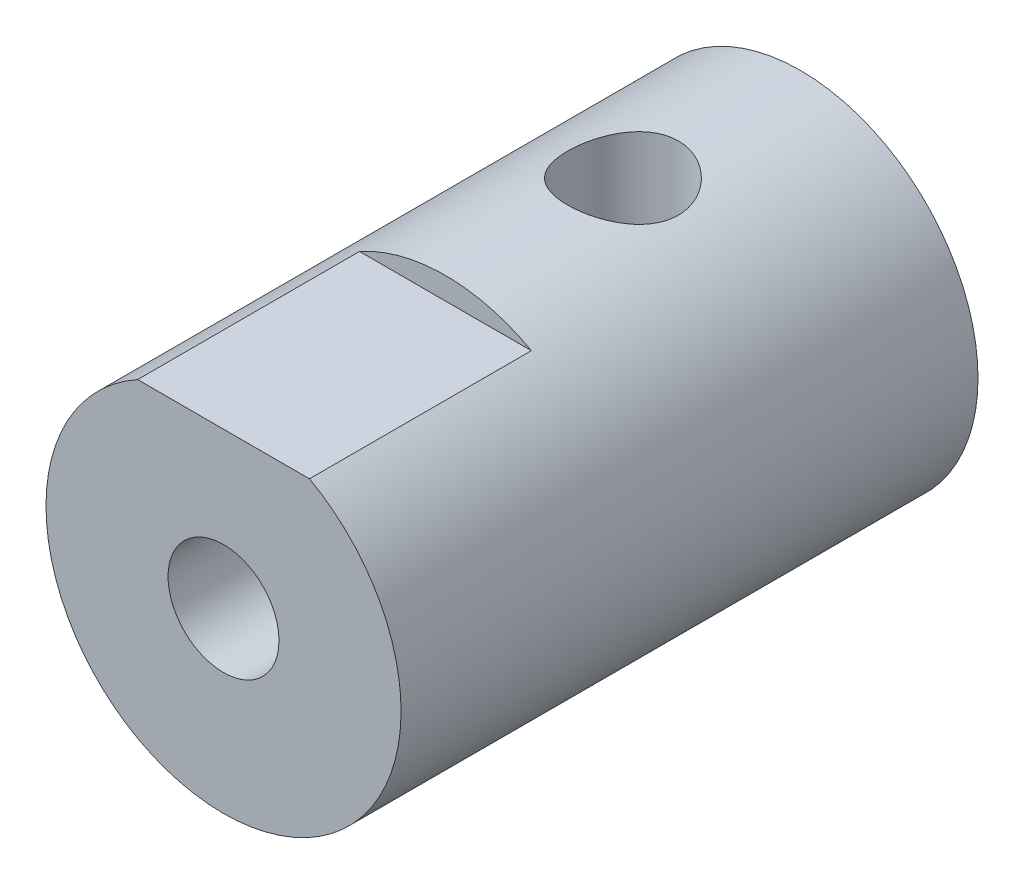
ISO-10303-21;
HEADER;
FILE_DESCRIPTION(('STEP AP214'),'2;1');
FILE_NAME('part.step','',(''),(''),'','','');
FILE_SCHEMA(('AUTOMOTIVE_DESIGN { 1 0 10303 214 1 1 1 1 }'));
ENDSEC;
DATA;
#1=APPLICATION_CONTEXT('core data for automotive mechanical design processes');
#2=APPLICATION_PROTOCOL_DEFINITION('international standard','automotive_design',2000,#1);
#3=PRODUCT_CONTEXT('',#1,'mechanical');
#4=PRODUCT('Part','Part','',(#3));
#5=PRODUCT_RELATED_PRODUCT_CATEGORY('part','',(#4));
#6=PRODUCT_DEFINITION_FORMATION('','',#4);
#7=PRODUCT_DEFINITION_CONTEXT('part definition',#1,'design');
#8=PRODUCT_DEFINITION('design','',#6,#7);
#9=PRODUCT_DEFINITION_SHAPE('','',#8);
#10=(LENGTH_UNIT() NAMED_UNIT(*) SI_UNIT(.MILLI.,.METRE.));
#11=(NAMED_UNIT(*) PLANE_ANGLE_UNIT() SI_UNIT($,.RADIAN.));
#12=(NAMED_UNIT(*) SI_UNIT($,.STERADIAN.) SOLID_ANGLE_UNIT());
#13=UNCERTAINTY_MEASURE_WITH_UNIT(LENGTH_MEASURE(1.E-05),#10,'distance_accuracy_value','');
#14=(GEOMETRIC_REPRESENTATION_CONTEXT(3) GLOBAL_UNCERTAINTY_ASSIGNED_CONTEXT((#13)) GLOBAL_UNIT_ASSIGNED_CONTEXT((#10,
#11,#12)) REPRESENTATION_CONTEXT('',''));
#15=CARTESIAN_POINT('',(0.,0.,0.));
#16=DIRECTION('',(0.,0.,1.));
#17=DIRECTION('',(1.,0.,0.));
#18=AXIS2_PLACEMENT_3D('',#15,#16,#17);
#19=CARTESIAN_POINT('',(0.,0.,5.));
#20=DIRECTION('',(0.,0.,-1.));
#21=DIRECTION('',(-1.,0.,0.));
#22=AXIS2_PLACEMENT_3D('',#19,#20,#21);
#23=CYLINDRICAL_SURFACE('',#22,4.);
#24=CARTESIAN_POINT('',(0.,4.,-2.75));
#25=CARTESIAN_POINT('',(-0.0684391851745465,3.99999965877989,-2.75000044658758));
#26=CARTESIAN_POINT('',(-0.136883052502859,3.99822694984841,-2.75563922694445));
#27=CARTESIAN_POINT('',(-0.271769209588448,3.99132894088807,-2.77798624153924));
#28=CARTESIAN_POINT('',(-0.338211042725907,3.9862028819986,-2.79469698136436));
#29=CARTESIAN_POINT('',(-0.467128543650807,3.97315815697909,-2.83856937119574));
#30=CARTESIAN_POINT('',(-0.529610176985804,3.96524381499025,-2.86571484465297));
#31=CARTESIAN_POINT('',(-0.64913480234646,3.94743969161093,-2.92961731767833));
#32=CARTESIAN_POINT('',(-0.706176935444885,3.93754959899905,-2.96637583178059));
#33=CARTESIAN_POINT('',(-0.814965334952281,3.91650213740282,-3.04965599201736));
#34=CARTESIAN_POINT('',(-0.86652002815666,3.90531715926989,-3.09642088506107));
#35=CARTESIAN_POINT('',(-0.961197382036994,3.88310046374208,-3.19786839241355));
#36=CARTESIAN_POINT('',(-1.0043184728987,3.87206877523457,-3.25255247749455));
#37=CARTESIAN_POINT('',(-1.08194336483114,3.85111144698172,-3.36994456380808));
#38=CARTESIAN_POINT('',(-1.11620784150129,3.84121988301796,-3.43281747752722));
#39=CARTESIAN_POINT('',(-1.17359741076672,3.82407801799234,-3.56379231498187));
#40=CARTESIAN_POINT('',(-1.19672543771945,3.81682702128688,-3.63189285579393));
#41=CARTESIAN_POINT('',(-1.23048459930033,3.80607606984501,-3.76922807745206));
#42=CARTESIAN_POINT('',(-1.24147110007865,3.80246972929508,-3.83836684363885));
#43=CARTESIAN_POINT('',(-1.25174555036988,3.7991005514095,-3.97759311891189));
#44=CARTESIAN_POINT('',(-1.25103660995772,3.79933669227334,-4.04768037082166));
#45=CARTESIAN_POINT('',(-1.23821824732739,3.80353189075438,-4.18387446026898));
#46=CARTESIAN_POINT('',(-1.22656057869383,3.80734341745949,-4.25002912586157));
#47=CARTESIAN_POINT('',(-1.19290813355626,3.81802025652489,-4.37939215653735));
#48=CARTESIAN_POINT('',(-1.17091225844551,3.82488589343115,-4.4426002077088));
#49=CARTESIAN_POINT('',(-1.11688874681277,3.84101044014297,-4.56535194443264));
#50=CARTESIAN_POINT('',(-1.08471925662082,3.85030284660824,-4.62482861069198));
#51=CARTESIAN_POINT('',(-1.01136020737848,3.8702185658007,-4.73768776787912));
#52=CARTESIAN_POINT('',(-0.970168305215773,3.88084222394551,-4.79106867025371));
#53=CARTESIAN_POINT('',(-0.877716954182124,3.90281527800493,-4.89277494341699));
#54=CARTESIAN_POINT('',(-0.826084570592818,3.91417569605696,-4.94075955777968));
#55=CARTESIAN_POINT('',(-0.715364408095532,3.9359157075958,-5.02747189357968));
#56=CARTESIAN_POINT('',(-0.656276077349021,3.94629522838372,-5.06619892921921));
#57=CARTESIAN_POINT('',(-0.531664610465454,3.96501294890191,-5.13352768860128));
#58=CARTESIAN_POINT('',(-0.466094906919279,3.97333460648208,-5.16204813546397));
#59=CARTESIAN_POINT('',(-0.330767977782644,3.98687955828554,-5.20755300085157));
#60=CARTESIAN_POINT('',(-0.261012030724608,3.99210379325151,-5.2245409222384));
#61=CARTESIAN_POINT('',(-0.122185157290344,3.99871389395014,-5.24591804257898));
#62=CARTESIAN_POINT('',(-0.0531918487888418,4.00024022895439,-5.25076854359352));
#63=CARTESIAN_POINT('',(0.0846303057325853,3.99969799730981,-5.24903377336267));
#64=CARTESIAN_POINT('',(0.153459174306506,3.99762995581125,-5.2424501726774));
#65=CARTESIAN_POINT('',(0.287219332975852,3.99022363769772,-5.21840440739361));
#66=CARTESIAN_POINT('',(0.352204978420949,3.98496793110725,-5.20121673238748));
#67=CARTESIAN_POINT('',(0.478351928861366,3.97180121379252,-5.15678564763331));
#68=CARTESIAN_POINT('',(0.539512760449016,3.96388987514204,-5.12954099597509));
#69=CARTESIAN_POINT('',(0.657932406672232,3.94598542759568,-5.06502678345121));
#70=CARTESIAN_POINT('',(0.715059739787956,3.9359462681821,-5.02752901250278));
#71=CARTESIAN_POINT('',(0.822365850960096,3.91493410002887,-4.94384678988298));
#72=CARTESIAN_POINT('',(0.872542738043337,3.90396083845862,-4.89765998225689));
#73=CARTESIAN_POINT('',(0.966587462919657,3.88176994885247,-4.79574110994631));
#74=CARTESIAN_POINT('',(1.01012652339774,3.87055986714446,-4.73970333625474));
#75=CARTESIAN_POINT('',(1.08721250244909,3.84961947087602,-4.62087338362926));
#76=CARTESIAN_POINT('',(1.12075957972524,3.839889132814,-4.55808131199557));
#77=CARTESIAN_POINT('',(1.17670083481141,3.82311782360754,-4.42765482711414));
#78=CARTESIAN_POINT('',(1.19913819558886,3.81606646468027,-4.3600403504953));
#79=CARTESIAN_POINT('',(1.23222894320964,3.80551170941212,-4.2217275066762));
#80=CARTESIAN_POINT('',(1.2428868141461,3.80200696302675,-4.15103032362869));
#81=CARTESIAN_POINT('',(1.2517940615754,3.79908292712494,-4.01199591244576));
#82=CARTESIAN_POINT('',(1.25058279621957,3.79948604683077,-3.94369654618707));
#83=CARTESIAN_POINT('',(1.23708818129474,3.80390090472383,-3.80832541508082));
#84=CARTESIAN_POINT('',(1.22480534822559,3.80791247457319,-3.741253593116));
#85=CARTESIAN_POINT('',(1.18987729913378,3.81896814158112,-3.61120596039822));
#86=CARTESIAN_POINT('',(1.16738642405944,3.82596698183474,-3.54818455890399));
#87=CARTESIAN_POINT('',(1.11280227335064,3.84219704261348,-3.42675958646865));
#88=CARTESIAN_POINT('',(1.08070704444254,3.85142871716522,-3.36835695792232));
#89=CARTESIAN_POINT('',(1.00635675013475,3.8715348703158,-3.25535402955943));
#90=CARTESIAN_POINT('',(0.963753335241274,3.88245948922441,-3.20099187049956));
#91=CARTESIAN_POINT('',(0.870208996404849,3.90448998821726,-3.1000136718882));
#92=CARTESIAN_POINT('',(0.819265842344403,3.91559591606795,-3.053399711009));
#93=CARTESIAN_POINT('',(0.708486662823332,3.93717271952329,-2.96771746163701));
#94=CARTESIAN_POINT('',(0.64841457448738,3.94761101730634,-2.92894526355003));
#95=CARTESIAN_POINT('',(0.522279138013654,3.96626769296916,-2.86210108486056));
#96=CARTESIAN_POINT('',(0.456218157795449,3.97448694315832,-2.83402489785817));
#97=CARTESIAN_POINT('',(0.325747635373978,3.98720650733461,-2.79140863239153));
#98=CARTESIAN_POINT('',(0.261670337112546,3.99196240806139,-2.77592513269466));
#99=CARTESIAN_POINT('',(0.131729895440248,3.99835900340486,-2.75522164003229));
#100=CARTESIAN_POINT('',(0.0658671161396749,4.00000032839644,-2.749999570196));
#101=CARTESIAN_POINT('',(0.,4.,-2.75));
#102=B_SPLINE_CURVE_WITH_KNOTS('',3,(#24,#25,#26,#27,#28,#29,#30,#31,#32,#33,#34,#35,#36,#37,
#38,#39,#40,#41,#42,#43,#44,#45,#46,#47,#48,#49,#50,#51,#52,#53,#54,#55,#56,#57,#58,#59,#60,#61,
#62,#63,#64,#65,#66,#67,#68,#69,#70,#71,#72,#73,#74,#75,#76,#77,#78,#79,#80,#81,#82,#83,#84,#85,
#86,#87,#88,#89,#90,#91,#92,#93,#94,#95,#96,#97,#98,#99,#100,#101),.UNSPECIFIED.,.T.,.F.,(4,2,2,
2,2,2,2,2,2,2,2,2,2,2,2,2,2,2,2,2,2,2,2,2,2,2,2,2,2,2,2,2,2,2,2,2,2,2,4),(0.,0.20507544943251,
0.410197323349067,0.615002479202436,0.819839921558392,1.03037822195158,1.24095567431276,
1.45673771247494,1.67246286279527,1.8816915016721,2.09086450295138,2.29176917422169,
2.49269519979063,2.69655642720545,2.90047066010359,3.113667472796,3.32688007413303,
3.5417546068977,3.75656384494554,3.96307568548238,4.16955735649363,4.37090626722872,
4.572280050345,4.77856324738343,4.98490245709259,5.1994177871314,5.41392970983712,
5.62760115751031,5.84119123892431,6.04512203476054,6.24904331751085,6.44997913396671,
6.65095584330174,6.85979514006362,7.06869037373341,7.28440668126413,7.50003806666337,
7.69744636651541,7.89481470763048),.UNSPECIFIED.);
#103=CARTESIAN_POINT('',(0.,4.,-2.75));
#104=VERTEX_POINT('',#103);
#105=EDGE_CURVE('E131',#104,#104,#102,.T.);
#106=ORIENTED_EDGE('',*,*,#105,.T.);
#107=EDGE_LOOP('',(#106));
#108=FACE_BOUND('',#107,.T.);
#109=DIRECTION('',(0.,0.,-1.));
#110=VECTOR('',#109,1.);
#111=CARTESIAN_POINT('',(-1.93649167310371,3.5,5.));
#112=LINE('',#111,#110);
#113=CARTESIAN_POINT('',(-1.93649167310371,3.5,5.));
#114=VERTEX_POINT('',#113);
#115=CARTESIAN_POINT('',(-1.93649167310371,3.5,0.));
#116=VERTEX_POINT('',#115);
#117=EDGE_CURVE('E56',#114,#116,#112,.T.);
#118=ORIENTED_EDGE('',*,*,#117,.T.);
#119=CARTESIAN_POINT('',(0.,0.,0.));
#120=DIRECTION('',(0.,0.,-1.));
#121=DIRECTION('',(-1.,0.,0.));
#122=AXIS2_PLACEMENT_3D('',#119,#120,#121);
#123=CIRCLE('',#122,4.);
#124=CARTESIAN_POINT('',(1.93649167310371,3.5,0.));
#125=VERTEX_POINT('',#124);
#126=EDGE_CURVE('E82',#116,#125,#123,.T.);
#127=ORIENTED_EDGE('',*,*,#126,.T.);
#128=DIRECTION('',(0.,0.,-1.));
#129=VECTOR('',#128,1.);
#130=CARTESIAN_POINT('',(1.93649167310371,3.5,5.));
#131=LINE('',#130,#129);
#132=CARTESIAN_POINT('',(1.93649167310371,3.5,5.));
#133=VERTEX_POINT('',#132);
#134=EDGE_CURVE('E11',#133,#125,#131,.T.);
#135=ORIENTED_EDGE('',*,*,#134,.F.);
#136=CARTESIAN_POINT('',(0.,0.,5.));
#137=DIRECTION('',(0.,0.,1.));
#138=DIRECTION('',(1.,0.,0.));
#139=AXIS2_PLACEMENT_3D('',#136,#137,#138);
#140=CIRCLE('',#139,4.);
#141=EDGE_CURVE('E121',#114,#133,#140,.T.);
#142=ORIENTED_EDGE('',*,*,#141,.F.);
#143=EDGE_LOOP('',(#118,#127,#135,#142));
#144=FACE_BOUND('',#143,.T.);
#145=CARTESIAN_POINT('',(0.,0.,-8.));
#146=DIRECTION('',(0.,0.,-1.));
#147=DIRECTION('',(-1.,0.,0.));
#148=AXIS2_PLACEMENT_3D('',#145,#146,#147);
#149=CIRCLE('',#148,4.);
#150=CARTESIAN_POINT('',(-4.,0.,-8.));
#151=VERTEX_POINT('',#150);
#152=EDGE_CURVE('E117',#151,#151,#149,.T.);
#153=ORIENTED_EDGE('',*,*,#152,.F.);
#154=EDGE_LOOP('',(#153));
#155=FACE_BOUND('',#154,.T.);
#156=ADVANCED_FACE('F47',(#108,#144,#155),#23,.T.);
#157=CARTESIAN_POINT('',(-1.93649167310371,3.5,5.));
#158=DIRECTION('',(0.,-1.,0.));
#159=DIRECTION('',(0.,0.,-1.));
#160=AXIS2_PLACEMENT_3D('',#157,#158,#159);
#161=PLANE('',#160);
#162=DIRECTION('',(-1.,0.,0.));
#163=VECTOR('',#162,1.);
#164=CARTESIAN_POINT('',(-1.93649167310371,3.5,0.));
#165=LINE('',#164,#163);
#166=EDGE_CURVE('E85',#125,#116,#165,.T.);
#167=ORIENTED_EDGE('',*,*,#166,.T.);
#168=ORIENTED_EDGE('',*,*,#117,.F.);
#169=DIRECTION('',(-1.,0.,0.));
#170=VECTOR('',#169,1.);
#171=CARTESIAN_POINT('',(-1.93649167310371,3.5,5.));
#172=LINE('',#171,#170);
#173=EDGE_CURVE('E72',#133,#114,#172,.T.);
#174=ORIENTED_EDGE('',*,*,#173,.F.);
#175=ORIENTED_EDGE('',*,*,#134,.T.);
#176=EDGE_LOOP('',(#167,#168,#174,#175));
#177=FACE_BOUND('',#176,.T.);
#178=ADVANCED_FACE('F165',(#177),#161,.F.);
#179=CARTESIAN_POINT('',(0.,0.,5.));
#180=DIRECTION('',(0.,0.,1.));
#181=DIRECTION('',(1.,0.,0.));
#182=AXIS2_PLACEMENT_3D('',#179,#180,#181);
#183=PLANE('',#182);
#184=CARTESIAN_POINT('',(0.,0.,5.));
#185=DIRECTION('',(0.,0.,1.));
#186=DIRECTION('',(1.,0.,0.));
#187=AXIS2_PLACEMENT_3D('',#184,#185,#186);
#188=CIRCLE('',#187,1.25);
#189=CARTESIAN_POINT('',(1.25,0.,5.));
#190=VERTEX_POINT('',#189);
#191=EDGE_CURVE('E127',#190,#190,#188,.T.);
#192=ORIENTED_EDGE('',*,*,#191,.F.);
#193=EDGE_LOOP('',(#192));
#194=FACE_BOUND('',#193,.T.);
#195=ORIENTED_EDGE('',*,*,#141,.T.);
#196=ORIENTED_EDGE('',*,*,#173,.T.);
#197=EDGE_LOOP('',(#195,#196));
#198=FACE_BOUND('',#197,.T.);
#199=ADVANCED_FACE('F160',(#194,#198),#183,.T.);
#200=CARTESIAN_POINT('',(0.,0.,-8.));
#201=DIRECTION('',(0.,0.,-1.));
#202=DIRECTION('',(-1.,0.,0.));
#203=AXIS2_PLACEMENT_3D('',#200,#201,#202);
#204=PLANE('',#203);
#205=CARTESIAN_POINT('',(0.,0.,-8.));
#206=DIRECTION('',(0.,0.,-1.));
#207=DIRECTION('',(-1.,0.,0.));
#208=AXIS2_PLACEMENT_3D('',#205,#206,#207);
#209=CIRCLE('',#208,2.);
#210=CARTESIAN_POINT('',(1.3228756555323,1.5,-8.));
#211=VERTEX_POINT('',#210);
#212=CARTESIAN_POINT('',(-1.3228756555323,1.5,-8.));
#213=VERTEX_POINT('',#212);
#214=EDGE_CURVE('E64',#211,#213,#209,.T.);
#215=ORIENTED_EDGE('',*,*,#214,.F.);
#216=DIRECTION('',(1.,0.,0.));
#217=VECTOR('',#216,1.);
#218=CARTESIAN_POINT('',(1.3228756555323,1.5,-8.));
#219=LINE('',#218,#217);
#220=EDGE_CURVE('E107',#213,#211,#219,.T.);
#221=ORIENTED_EDGE('',*,*,#220,.F.);
#222=EDGE_LOOP('',(#215,#221));
#223=FACE_BOUND('',#222,.T.);
#224=ORIENTED_EDGE('',*,*,#152,.T.);
#225=EDGE_LOOP('',(#224));
#226=FACE_BOUND('',#225,.T.);
#227=ADVANCED_FACE('F157',(#223,#226),#204,.T.);
#228=CARTESIAN_POINT('',(0.,0.,0.));
#229=DIRECTION('',(0.,0.,-1.));
#230=DIRECTION('',(-1.,0.,0.));
#231=AXIS2_PLACEMENT_3D('',#228,#229,#230);
#232=PLANE('',#231);
#233=ORIENTED_EDGE('',*,*,#166,.F.);
#234=ORIENTED_EDGE('',*,*,#126,.F.);
#235=EDGE_LOOP('',(#233,#234));
#236=FACE_BOUND('',#235,.T.);
#237=ADVANCED_FACE('F156',(#236),#232,.F.);
#238=CARTESIAN_POINT('',(0.,0.,0.));
#239=DIRECTION('',(0.,0.,-1.));
#240=DIRECTION('',(-1.,0.,0.));
#241=AXIS2_PLACEMENT_3D('',#238,#239,#240);
#242=CYLINDRICAL_SURFACE('',#241,2.);
#243=ORIENTED_EDGE('',*,*,#214,.T.);
#244=DIRECTION('',(0.,0.,-1.));
#245=VECTOR('',#244,1.);
#246=CARTESIAN_POINT('',(-1.3228756555323,1.5,0.));
#247=LINE('',#246,#245);
#248=CARTESIAN_POINT('',(-1.3228756555323,1.5,0.));
#249=VERTEX_POINT('',#248);
#250=EDGE_CURVE('E93',#249,#213,#247,.T.);
#251=ORIENTED_EDGE('',*,*,#250,.F.);
#252=CARTESIAN_POINT('',(0.,0.,0.));
#253=DIRECTION('',(0.,0.,-1.));
#254=DIRECTION('',(-1.,0.,0.));
#255=AXIS2_PLACEMENT_3D('',#252,#253,#254);
#256=CIRCLE('',#255,2.);
#257=CARTESIAN_POINT('',(1.3228756555323,1.5,0.));
#258=VERTEX_POINT('',#257);
#259=EDGE_CURVE('E96',#258,#249,#256,.T.);
#260=ORIENTED_EDGE('',*,*,#259,.F.);
#261=DIRECTION('',(0.,0.,-1.));
#262=VECTOR('',#261,1.);
#263=CARTESIAN_POINT('',(1.3228756555323,1.5,0.));
#264=LINE('',#263,#262);
#265=EDGE_CURVE('E102',#258,#211,#264,.T.);
#266=ORIENTED_EDGE('',*,*,#265,.T.);
#267=EDGE_LOOP('',(#243,#251,#260,#266));
#268=FACE_BOUND('',#267,.T.);
#269=ADVANCED_FACE('F95',(#268),#242,.F.);
#270=CARTESIAN_POINT('',(1.3228756555323,1.5,0.));
#271=DIRECTION('',(0.,1.,0.));
#272=DIRECTION('',(0.,0.,1.));
#273=AXIS2_PLACEMENT_3D('',#270,#271,#272);
#274=PLANE('',#273);
#275=CARTESIAN_POINT('',(0.,1.5,-4.));
#276=DIRECTION('',(0.,1.,0.));
#277=DIRECTION('',(0.,0.,1.));
#278=AXIS2_PLACEMENT_3D('',#275,#276,#277);
#279=CIRCLE('',#278,1.25);
#280=CARTESIAN_POINT('',(0.,1.5,-2.75));
#281=VERTEX_POINT('',#280);
#282=EDGE_CURVE('E51',#281,#281,#279,.T.);
#283=ORIENTED_EDGE('',*,*,#282,.T.);
#284=EDGE_LOOP('',(#283));
#285=FACE_BOUND('',#284,.T.);
#286=ORIENTED_EDGE('',*,*,#220,.T.);
#287=ORIENTED_EDGE('',*,*,#265,.F.);
#288=DIRECTION('',(1.,0.,0.));
#289=VECTOR('',#288,1.);
#290=CARTESIAN_POINT('',(1.3228756555323,1.5,0.));
#291=LINE('',#290,#289);
#292=EDGE_CURVE('E103',#249,#258,#291,.T.);
#293=ORIENTED_EDGE('',*,*,#292,.F.);
#294=ORIENTED_EDGE('',*,*,#250,.T.);
#295=EDGE_LOOP('',(#286,#287,#293,#294));
#296=FACE_BOUND('',#295,.T.);
#297=ADVANCED_FACE('F109',(#285,#296),#274,.F.);
#298=CARTESIAN_POINT('',(0.,0.,0.));
#299=DIRECTION('',(0.,0.,-1.));
#300=DIRECTION('',(-1.,0.,0.));
#301=AXIS2_PLACEMENT_3D('',#298,#299,#300);
#302=PLANE('',#301);
#303=CARTESIAN_POINT('',(0.,0.,0.));
#304=DIRECTION('',(0.,0.,-1.));
#305=DIRECTION('',(-1.,0.,0.));
#306=AXIS2_PLACEMENT_3D('',#303,#304,#305);
#307=CIRCLE('',#306,1.25);
#308=CARTESIAN_POINT('',(-1.25,0.,0.));
#309=VERTEX_POINT('',#308);
#310=EDGE_CURVE('E114',#309,#309,#307,.T.);
#311=ORIENTED_EDGE('',*,*,#310,.F.);
#312=EDGE_LOOP('',(#311));
#313=FACE_BOUND('',#312,.T.);
#314=ORIENTED_EDGE('',*,*,#259,.T.);
#315=ORIENTED_EDGE('',*,*,#292,.T.);
#316=EDGE_LOOP('',(#314,#315));
#317=FACE_BOUND('',#316,.T.);
#318=ADVANCED_FACE('F106',(#313,#317),#302,.T.);
#319=CARTESIAN_POINT('',(0.,0.,-3.));
#320=DIRECTION('',(0.,0.,1.));
#321=DIRECTION('',(1.,0.,0.));
#322=AXIS2_PLACEMENT_3D('',#319,#320,#321);
#323=CYLINDRICAL_SURFACE('',#322,1.25);
#324=ORIENTED_EDGE('',*,*,#310,.T.);
#325=EDGE_LOOP('',(#324));
#326=FACE_BOUND('',#325,.T.);
#327=ORIENTED_EDGE('',*,*,#191,.T.);
#328=EDGE_LOOP('',(#327));
#329=FACE_BOUND('',#328,.T.);
#330=ADVANCED_FACE('F144',(#326,#329),#323,.F.);
#331=CARTESIAN_POINT('',(0.,0.,-4.));
#332=DIRECTION('',(0.,1.,0.));
#333=DIRECTION('',(0.,0.,1.));
#334=AXIS2_PLACEMENT_3D('',#331,#332,#333);
#335=CYLINDRICAL_SURFACE('',#334,1.25);
#336=ORIENTED_EDGE('',*,*,#282,.F.);
#337=EDGE_LOOP('',(#336));
#338=FACE_BOUND('',#337,.T.);
#339=ORIENTED_EDGE('',*,*,#105,.F.);
#340=EDGE_LOOP('',(#339));
#341=FACE_BOUND('',#340,.T.);
#342=ADVANCED_FACE('F140',(#338,#341),#335,.F.);
#343=CLOSED_SHELL('',(#156,#178,#199,#227,#237,#269,#297,#318,#330,#342));
#344=MANIFOLD_SOLID_BREP('B2',#343);
#345=ADVANCED_BREP_SHAPE_REPRESENTATION('',(#18,#344),#14);
#346=SHAPE_DEFINITION_REPRESENTATION(#9,#345);
ENDSEC;
END-ISO-10303-21;
